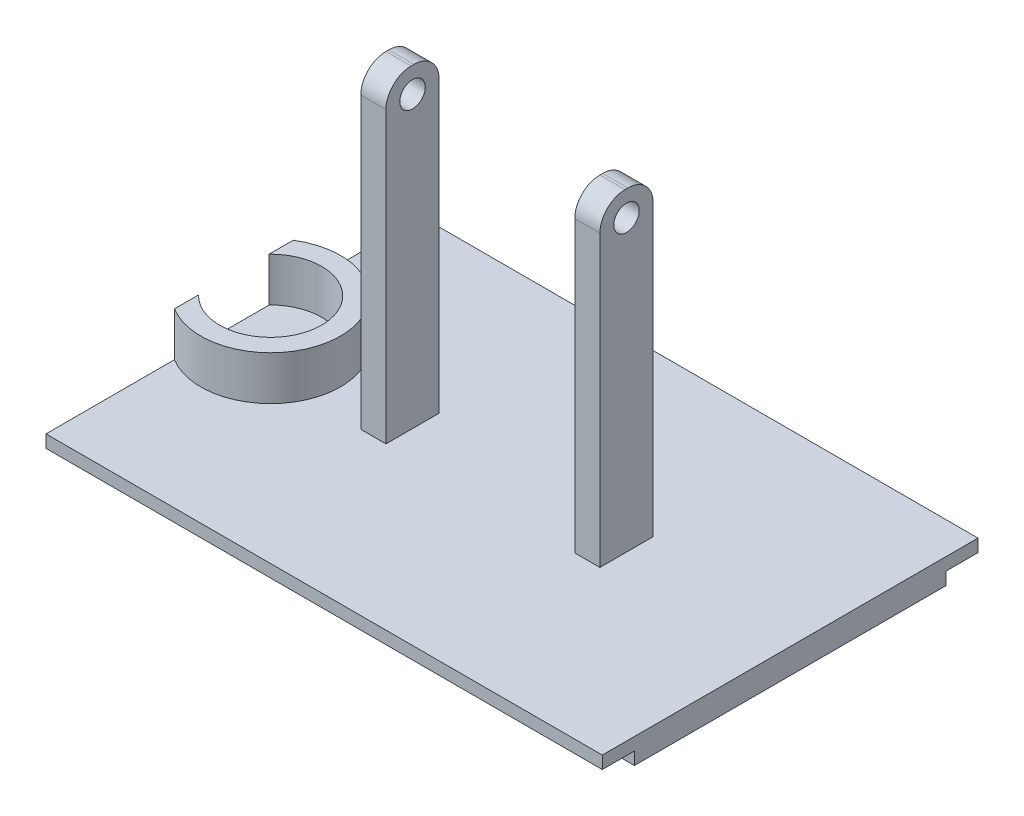
ISO-10303-21;
HEADER;
FILE_DESCRIPTION(('STEP AP214'),'2;1');
FILE_NAME('part.step','',(''),(''),'','','');
FILE_SCHEMA(('AUTOMOTIVE_DESIGN { 1 0 10303 214 1 1 1 1 }'));
ENDSEC;
DATA;
#1=APPLICATION_CONTEXT('core data for automotive mechanical design processes');
#2=APPLICATION_PROTOCOL_DEFINITION('international standard','automotive_design',2000,#1);
#3=PRODUCT_CONTEXT('',#1,'mechanical');
#4=PRODUCT('Part','Part','',(#3));
#5=PRODUCT_RELATED_PRODUCT_CATEGORY('part','',(#4));
#6=PRODUCT_DEFINITION_FORMATION('','',#4);
#7=PRODUCT_DEFINITION_CONTEXT('part definition',#1,'design');
#8=PRODUCT_DEFINITION('design','',#6,#7);
#9=PRODUCT_DEFINITION_SHAPE('','',#8);
#10=(LENGTH_UNIT() NAMED_UNIT(*) SI_UNIT(.MILLI.,.METRE.));
#11=(NAMED_UNIT(*) PLANE_ANGLE_UNIT() SI_UNIT($,.RADIAN.));
#12=(NAMED_UNIT(*) SI_UNIT($,.STERADIAN.) SOLID_ANGLE_UNIT());
#13=UNCERTAINTY_MEASURE_WITH_UNIT(LENGTH_MEASURE(1.E-05),#10,'distance_accuracy_value','');
#14=(GEOMETRIC_REPRESENTATION_CONTEXT(3) GLOBAL_UNCERTAINTY_ASSIGNED_CONTEXT((#13)) GLOBAL_UNIT_ASSIGNED_CONTEXT((#10,
#11,#12)) REPRESENTATION_CONTEXT('',''));
#15=CARTESIAN_POINT('',(0.,0.,0.));
#16=DIRECTION('',(0.,0.,1.));
#17=DIRECTION('',(1.,0.,0.));
#18=AXIS2_PLACEMENT_3D('',#15,#16,#17);
#19=CARTESIAN_POINT('',(-38.4161229651901,4.,59.7));
#20=DIRECTION('',(1.,0.,0.));
#21=DIRECTION('',(0.,0.,-1.));
#22=AXIS2_PLACEMENT_3D('',#19,#20,#21);
#23=PLANE('',#22);
#24=DIRECTION('',(0.,-1.,0.));
#25=VECTOR('',#24,1.);
#26=CARTESIAN_POINT('',(-38.4161229651901,-41.8587852174272,54.6));
#27=LINE('',#26,#25);
#28=CARTESIAN_POINT('',(-38.4161229651901,2.,54.6));
#29=VERTEX_POINT('',#28);
#30=CARTESIAN_POINT('',(-38.4161229651901,0.,54.6));
#31=VERTEX_POINT('',#30);
#32=EDGE_CURVE('E200',#29,#31,#27,.T.);
#33=ORIENTED_EDGE('',*,*,#32,.F.);
#34=DIRECTION('',(0.,0.,-1.));
#35=VECTOR('',#34,1.);
#36=CARTESIAN_POINT('',(-38.4161229651901,1.99999999999999,29.85));
#37=LINE('',#36,#35);
#38=CARTESIAN_POINT('',(-38.4161229651901,2.,59.7));
#39=VERTEX_POINT('',#38);
#40=EDGE_CURVE('E206',#39,#29,#37,.T.);
#41=ORIENTED_EDGE('',*,*,#40,.F.);
#42=DIRECTION('',(0.,-1.,0.));
#43=VECTOR('',#42,1.);
#44=CARTESIAN_POINT('',(-38.4161229651901,4.,59.7));
#45=LINE('',#44,#43);
#46=CARTESIAN_POINT('',(-38.4161229651901,4.,59.7));
#47=VERTEX_POINT('',#46);
#48=EDGE_CURVE('E352',#47,#39,#45,.T.);
#49=ORIENTED_EDGE('',*,*,#48,.F.);
#50=DIRECTION('',(0.,0.,1.));
#51=VECTOR('',#50,1.);
#52=CARTESIAN_POINT('',(-38.4161229651901,4.,59.7));
#53=LINE('',#52,#51);
#54=CARTESIAN_POINT('',(-38.4161229651901,4.,39.2883996562125));
#55=VERTEX_POINT('',#54);
#56=EDGE_CURVE('E326',#55,#47,#53,.T.);
#57=ORIENTED_EDGE('',*,*,#56,.F.);
#58=DIRECTION('',(0.,-1.,0.));
#59=VECTOR('',#58,1.);
#60=CARTESIAN_POINT('',(-38.4161229651901,11.,39.2883996562125));
#61=LINE('',#60,#59);
#62=CARTESIAN_POINT('',(-38.4161229651901,11.,39.2883996562125));
#63=VERTEX_POINT('',#62);
#64=EDGE_CURVE('E331',#63,#55,#61,.T.);
#65=ORIENTED_EDGE('',*,*,#64,.F.);
#66=DIRECTION('',(0.,0.,1.));
#67=VECTOR('',#66,1.);
#68=CARTESIAN_POINT('',(-38.4161229651901,11.,29.85));
#69=LINE('',#68,#67);
#70=CARTESIAN_POINT('',(-38.4161229651901,11.,35.4610059766848));
#71=VERTEX_POINT('',#70);
#72=EDGE_CURVE('E307',#71,#63,#69,.T.);
#73=ORIENTED_EDGE('',*,*,#72,.F.);
#74=DIRECTION('',(0.,-1.,0.));
#75=VECTOR('',#74,1.);
#76=CARTESIAN_POINT('',(-38.4161229651901,11.,35.4610059766848));
#77=LINE('',#76,#75);
#78=CARTESIAN_POINT('',(-38.4161229651901,4.,35.4610059766848));
#79=VERTEX_POINT('',#78);
#80=EDGE_CURVE('E317',#71,#79,#77,.T.);
#81=ORIENTED_EDGE('',*,*,#80,.T.);
#82=CARTESIAN_POINT('',(-38.4161229651901,4.,24.2389940233153));
#83=VERTEX_POINT('',#82);
#84=EDGE_CURVE('E533',#83,#79,#53,.T.);
#85=ORIENTED_EDGE('',*,*,#84,.F.);
#86=DIRECTION('',(0.,-1.,0.));
#87=VECTOR('',#86,1.);
#88=CARTESIAN_POINT('',(-38.4161229651901,11.,24.2389940233153));
#89=LINE('',#88,#87);
#90=CARTESIAN_POINT('',(-38.4161229651901,11.,24.2389940233153));
#91=VERTEX_POINT('',#90);
#92=EDGE_CURVE('E332',#91,#83,#89,.T.);
#93=ORIENTED_EDGE('',*,*,#92,.F.);
#94=CARTESIAN_POINT('',(-38.4161229651901,11.,20.4116003437875));
#95=VERTEX_POINT('',#94);
#96=EDGE_CURVE('E312',#95,#91,#69,.T.);
#97=ORIENTED_EDGE('',*,*,#96,.F.);
#98=DIRECTION('',(0.,-1.,0.));
#99=VECTOR('',#98,1.);
#100=CARTESIAN_POINT('',(-38.4161229651901,11.,20.4116003437875));
#101=LINE('',#100,#99);
#102=CARTESIAN_POINT('',(-38.4161229651901,4.,20.4116003437875));
#103=VERTEX_POINT('',#102);
#104=EDGE_CURVE('E328',#95,#103,#101,.T.);
#105=ORIENTED_EDGE('',*,*,#104,.T.);
#106=CARTESIAN_POINT('',(-38.4161229651901,4.,0.));
#107=VERTEX_POINT('',#106);
#108=EDGE_CURVE('E519',#107,#103,#53,.T.);
#109=ORIENTED_EDGE('',*,*,#108,.F.);
#110=DIRECTION('',(0.,-1.,0.));
#111=VECTOR('',#110,1.);
#112=CARTESIAN_POINT('',(-38.4161229651901,4.,0.));
#113=LINE('',#112,#111);
#114=CARTESIAN_POINT('',(-38.4161229651901,2.,0.));
#115=VERTEX_POINT('',#114);
#116=EDGE_CURVE('E514',#107,#115,#113,.T.);
#117=ORIENTED_EDGE('',*,*,#116,.T.);
#118=DIRECTION('',(0.,0.,1.));
#119=VECTOR('',#118,1.);
#120=CARTESIAN_POINT('',(-38.4161229651901,2.,29.85));
#121=LINE('',#120,#119);
#122=CARTESIAN_POINT('',(-38.4161229651901,2.,5.1));
#123=VERTEX_POINT('',#122);
#124=EDGE_CURVE('E229',#115,#123,#121,.T.);
#125=ORIENTED_EDGE('',*,*,#124,.T.);
#126=DIRECTION('',(0.,-1.,0.));
#127=VECTOR('',#126,1.);
#128=CARTESIAN_POINT('',(-38.4161229651901,-41.8587852174272,5.1));
#129=LINE('',#128,#127);
#130=CARTESIAN_POINT('',(-38.4161229651901,0.,5.1));
#131=VERTEX_POINT('',#130);
#132=EDGE_CURVE('E223',#123,#131,#129,.T.);
#133=ORIENTED_EDGE('',*,*,#132,.T.);
#134=DIRECTION('',(0.,0.,1.));
#135=VECTOR('',#134,1.);
#136=CARTESIAN_POINT('',(-38.4161229651901,0.,59.7));
#137=LINE('',#136,#135);
#138=EDGE_CURVE('E216',#131,#31,#137,.T.);
#139=ORIENTED_EDGE('',*,*,#138,.T.);
#140=EDGE_LOOP('',(#33,#41,#49,#57,#65,#73,#81,#85,#93,#97,#105,#109,#117,#125,#133,#139));
#141=FACE_BOUND('',#140,.T.);
#142=ADVANCED_FACE('F34',(#141),#23,.F.);
#143=CARTESIAN_POINT('',(49.9738770348099,4.,0.));
#144=DIRECTION('',(-1.,0.,0.));
#145=DIRECTION('',(0.,0.,1.));
#146=AXIS2_PLACEMENT_3D('',#143,#144,#145);
#147=PLANE('',#146);
#148=DIRECTION('',(0.,-1.,0.));
#149=VECTOR('',#148,1.);
#150=CARTESIAN_POINT('',(49.9738770348099,4.,59.7));
#151=LINE('',#150,#149);
#152=CARTESIAN_POINT('',(49.9738770348099,4.,59.7));
#153=VERTEX_POINT('',#152);
#154=CARTESIAN_POINT('',(49.9738770348099,2.,59.7));
#155=VERTEX_POINT('',#154);
#156=EDGE_CURVE('E522',#153,#155,#151,.T.);
#157=ORIENTED_EDGE('',*,*,#156,.T.);
#158=DIRECTION('',(0.,0.,1.));
#159=VECTOR('',#158,1.);
#160=CARTESIAN_POINT('',(49.9738770348099,1.99999999999999,29.85));
#161=LINE('',#160,#159);
#162=CARTESIAN_POINT('',(49.9738770348099,1.99999999999999,54.6));
#163=VERTEX_POINT('',#162);
#164=EDGE_CURVE('E49',#163,#155,#161,.T.);
#165=ORIENTED_EDGE('',*,*,#164,.F.);
#166=DIRECTION('',(0.,1.,0.));
#167=VECTOR('',#166,1.);
#168=CARTESIAN_POINT('',(49.9738770348099,-41.8587852174272,54.6));
#169=LINE('',#168,#167);
#170=CARTESIAN_POINT('',(49.9738770348099,0.,54.6));
#171=VERTEX_POINT('',#170);
#172=EDGE_CURVE('E202',#171,#163,#169,.T.);
#173=ORIENTED_EDGE('',*,*,#172,.F.);
#174=DIRECTION('',(0.,0.,-1.));
#175=VECTOR('',#174,1.);
#176=CARTESIAN_POINT('',(49.9738770348099,0.,0.));
#177=LINE('',#176,#175);
#178=CARTESIAN_POINT('',(49.9738770348099,0.,5.1));
#179=VERTEX_POINT('',#178);
#180=EDGE_CURVE('E57',#171,#179,#177,.T.);
#181=ORIENTED_EDGE('',*,*,#180,.T.);
#182=DIRECTION('',(0.,1.,0.));
#183=VECTOR('',#182,1.);
#184=CARTESIAN_POINT('',(49.9738770348099,-41.8587852174272,5.1));
#185=LINE('',#184,#183);
#186=CARTESIAN_POINT('',(49.9738770348099,2.,5.09999999999999));
#187=VERTEX_POINT('',#186);
#188=EDGE_CURVE('E224',#179,#187,#185,.T.);
#189=ORIENTED_EDGE('',*,*,#188,.T.);
#190=DIRECTION('',(0.,0.,-1.));
#191=VECTOR('',#190,1.);
#192=CARTESIAN_POINT('',(49.9738770348099,2.,29.85));
#193=LINE('',#192,#191);
#194=CARTESIAN_POINT('',(49.9738770348099,2.,0.));
#195=VERTEX_POINT('',#194);
#196=EDGE_CURVE('E227',#187,#195,#193,.T.);
#197=ORIENTED_EDGE('',*,*,#196,.T.);
#198=DIRECTION('',(0.,-1.,0.));
#199=VECTOR('',#198,1.);
#200=CARTESIAN_POINT('',(49.9738770348099,4.,0.));
#201=LINE('',#200,#199);
#202=CARTESIAN_POINT('',(49.9738770348099,4.,0.));
#203=VERTEX_POINT('',#202);
#204=EDGE_CURVE('E517',#203,#195,#201,.T.);
#205=ORIENTED_EDGE('',*,*,#204,.F.);
#206=DIRECTION('',(0.,0.,-1.));
#207=VECTOR('',#206,1.);
#208=CARTESIAN_POINT('',(49.9738770348099,4.,0.));
#209=LINE('',#208,#207);
#210=EDGE_CURVE('E524',#153,#203,#209,.T.);
#211=ORIENTED_EDGE('',*,*,#210,.F.);
#212=EDGE_LOOP('',(#157,#165,#173,#181,#189,#197,#205,#211));
#213=FACE_BOUND('',#212,.T.);
#214=ADVANCED_FACE('F421',(#213),#147,.F.);
#215=CARTESIAN_POINT('',(-38.4161229651901,4.,0.));
#216=DIRECTION('',(0.,0.,1.));
#217=DIRECTION('',(1.,0.,0.));
#218=AXIS2_PLACEMENT_3D('',#215,#216,#217);
#219=PLANE('',#218);
#220=DIRECTION('',(-1.,0.,0.));
#221=VECTOR('',#220,1.);
#222=CARTESIAN_POINT('',(55.4520154047309,2.,0.));
#223=LINE('',#222,#221);
#224=EDGE_CURVE('E235',#195,#115,#223,.T.);
#225=ORIENTED_EDGE('',*,*,#224,.T.);
#226=ORIENTED_EDGE('',*,*,#116,.F.);
#227=DIRECTION('',(-1.,0.,0.));
#228=VECTOR('',#227,1.);
#229=CARTESIAN_POINT('',(-38.4161229651901,4.,0.));
#230=LINE('',#229,#228);
#231=EDGE_CURVE('E520',#203,#107,#230,.T.);
#232=ORIENTED_EDGE('',*,*,#231,.F.);
#233=ORIENTED_EDGE('',*,*,#204,.T.);
#234=EDGE_LOOP('',(#225,#226,#232,#233));
#235=FACE_BOUND('',#234,.T.);
#236=ADVANCED_FACE('F426',(#235),#219,.F.);
#237=CARTESIAN_POINT('',(-38.4161229651901,0.,0.));
#238=DIRECTION('',(0.,-1.,0.));
#239=DIRECTION('',(0.,0.,-1.));
#240=AXIS2_PLACEMENT_3D('',#237,#238,#239);
#241=PLANE('',#240);
#242=DIRECTION('',(-1.,0.,0.));
#243=VECTOR('',#242,1.);
#244=CARTESIAN_POINT('',(55.4520154047309,0.,54.6));
#245=LINE('',#244,#243);
#246=EDGE_CURVE('E203',#171,#31,#245,.T.);
#247=ORIENTED_EDGE('',*,*,#246,.T.);
#248=ORIENTED_EDGE('',*,*,#138,.F.);
#249=DIRECTION('',(-1.,0.,0.));
#250=VECTOR('',#249,1.);
#251=CARTESIAN_POINT('',(55.4520154047309,0.,5.1));
#252=LINE('',#251,#250);
#253=EDGE_CURVE('E233',#179,#131,#252,.T.);
#254=ORIENTED_EDGE('',*,*,#253,.F.);
#255=ORIENTED_EDGE('',*,*,#180,.F.);
#256=EDGE_LOOP('',(#247,#248,#254,#255));
#257=FACE_BOUND('',#256,.T.);
#258=ADVANCED_FACE('F502',(#257),#241,.T.);
#259=CARTESIAN_POINT('',(-14.0261229651901,4.,25.626729832475));
#260=DIRECTION('',(1.,0.,0.));
#261=DIRECTION('',(0.,0.,1.));
#262=AXIS2_PLACEMENT_3D('',#259,#260,#261);
#263=PLANE('',#262);
#264=DIRECTION('',(0.,-1.,0.));
#265=VECTOR('',#264,1.);
#266=CARTESIAN_POINT('',(-14.0261229651901,4.,34.073270167525));
#267=LINE('',#266,#265);
#268=CARTESIAN_POINT('',(-14.0261229651901,50.,34.073270167525));
#269=VERTEX_POINT('',#268);
#270=CARTESIAN_POINT('',(-14.0261229651901,4.,34.073270167525));
#271=VERTEX_POINT('',#270);
#272=EDGE_CURVE('E250',#269,#271,#267,.T.);
#273=ORIENTED_EDGE('',*,*,#272,.F.);
#274=CARTESIAN_POINT('',(-14.0261229651901,50.,30.073270167525));
#275=DIRECTION('',(1.,0.,0.));
#276=DIRECTION('',(0.,0.,-1.));
#277=AXIS2_PLACEMENT_3D('',#274,#275,#276);
#278=CIRCLE('',#277,4.);
#279=CARTESIAN_POINT('',(-14.0261229651901,54.,30.073270167525));
#280=VERTEX_POINT('',#279);
#281=EDGE_CURVE('E42',#269,#280,#278,.F.);
#282=ORIENTED_EDGE('',*,*,#281,.T.);
#283=DIRECTION('',(0.,0.,1.));
#284=VECTOR('',#283,1.);
#285=CARTESIAN_POINT('',(-14.0261229651901,54.,34.073270167525));
#286=LINE('',#285,#284);
#287=CARTESIAN_POINT('',(-14.0261229651901,54.,29.626729832475));
#288=VERTEX_POINT('',#287);
#289=EDGE_CURVE('E253',#288,#280,#286,.T.);
#290=ORIENTED_EDGE('',*,*,#289,.F.);
#291=CARTESIAN_POINT('',(-14.0261229651901,50.,29.626729832475));
#292=DIRECTION('',(1.,0.,0.));
#293=DIRECTION('',(0.,0.,-1.));
#294=AXIS2_PLACEMENT_3D('',#291,#292,#293);
#295=CIRCLE('',#294,4.);
#296=CARTESIAN_POINT('',(-14.0261229651901,50.,25.626729832475));
#297=VERTEX_POINT('',#296);
#298=EDGE_CURVE('E378',#288,#297,#295,.F.);
#299=ORIENTED_EDGE('',*,*,#298,.T.);
#300=DIRECTION('',(0.,1.,0.));
#301=VECTOR('',#300,1.);
#302=CARTESIAN_POINT('',(-14.0261229651901,54.,25.626729832475));
#303=LINE('',#302,#301);
#304=CARTESIAN_POINT('',(-14.0261229651901,4.,25.626729832475));
#305=VERTEX_POINT('',#304);
#306=EDGE_CURVE('E256',#305,#297,#303,.T.);
#307=ORIENTED_EDGE('',*,*,#306,.F.);
#308=DIRECTION('',(0.,0.,-1.));
#309=VECTOR('',#308,1.);
#310=CARTESIAN_POINT('',(-14.0261229651901,4.,27.6967834458924));
#311=LINE('',#310,#309);
#312=EDGE_CURVE('E247',#271,#305,#311,.T.);
#313=ORIENTED_EDGE('',*,*,#312,.F.);
#314=EDGE_LOOP('',(#273,#282,#290,#299,#307,#313));
#315=FACE_BOUND('',#314,.T.);
#316=CARTESIAN_POINT('',(-14.0261229651901,50.,29.85));
#317=DIRECTION('',(1.,0.,0.));
#318=DIRECTION('',(0.,0.,-1.));
#319=AXIS2_PLACEMENT_3D('',#316,#317,#318);
#320=CIRCLE('',#319,2.025);
#321=CARTESIAN_POINT('',(-14.0261229651901,50.,27.825));
#322=VERTEX_POINT('',#321);
#323=EDGE_CURVE('E226',#322,#322,#320,.T.);
#324=ORIENTED_EDGE('',*,*,#323,.T.);
#325=EDGE_LOOP('',(#324));
#326=FACE_BOUND('',#325,.T.);
#327=ADVANCED_FACE('F383',(#315,#326),#263,.F.);
#328=CARTESIAN_POINT('',(-10.0261229651901,4.,25.626729832475));
#329=DIRECTION('',(1.,0.,0.));
#330=DIRECTION('',(0.,0.,1.));
#331=AXIS2_PLACEMENT_3D('',#328,#329,#330);
#332=PLANE('',#331);
#333=DIRECTION('',(0.,0.,1.));
#334=VECTOR('',#333,1.);
#335=CARTESIAN_POINT('',(-10.0261229651901,54.,34.073270167525));
#336=LINE('',#335,#334);
#337=CARTESIAN_POINT('',(-10.0261229651901,54.,29.626729832475));
#338=VERTEX_POINT('',#337);
#339=CARTESIAN_POINT('',(-10.0261229651901,54.,30.073270167525));
#340=VERTEX_POINT('',#339);
#341=EDGE_CURVE('E263',#338,#340,#336,.T.);
#342=ORIENTED_EDGE('',*,*,#341,.T.);
#343=CARTESIAN_POINT('',(-10.0261229651901,50.,30.073270167525));
#344=DIRECTION('',(1.,0.,0.));
#345=DIRECTION('',(0.,0.,-1.));
#346=AXIS2_PLACEMENT_3D('',#343,#344,#345);
#347=CIRCLE('',#346,4.);
#348=CARTESIAN_POINT('',(-10.0261229651901,50.,34.073270167525));
#349=VERTEX_POINT('',#348);
#350=EDGE_CURVE('E374',#340,#349,#347,.T.);
#351=ORIENTED_EDGE('',*,*,#350,.T.);
#352=DIRECTION('',(0.,-1.,0.));
#353=VECTOR('',#352,1.);
#354=CARTESIAN_POINT('',(-10.0261229651901,4.,34.073270167525));
#355=LINE('',#354,#353);
#356=CARTESIAN_POINT('',(-10.0261229651901,4.,34.073270167525));
#357=VERTEX_POINT('',#356);
#358=EDGE_CURVE('E261',#349,#357,#355,.T.);
#359=ORIENTED_EDGE('',*,*,#358,.T.);
#360=DIRECTION('',(0.,0.,-1.));
#361=VECTOR('',#360,1.);
#362=CARTESIAN_POINT('',(-10.0261229651901,4.,32.0032165541076));
#363=LINE('',#362,#361);
#364=CARTESIAN_POINT('',(-10.0261229651901,4.,25.626729832475));
#365=VERTEX_POINT('',#364);
#366=EDGE_CURVE('E244',#357,#365,#363,.T.);
#367=ORIENTED_EDGE('',*,*,#366,.T.);
#368=DIRECTION('',(0.,1.,0.));
#369=VECTOR('',#368,1.);
#370=CARTESIAN_POINT('',(-10.0261229651901,54.,25.626729832475));
#371=LINE('',#370,#369);
#372=CARTESIAN_POINT('',(-10.0261229651901,50.,25.626729832475));
#373=VERTEX_POINT('',#372);
#374=EDGE_CURVE('E251',#365,#373,#371,.T.);
#375=ORIENTED_EDGE('',*,*,#374,.T.);
#376=CARTESIAN_POINT('',(-10.0261229651901,50.,29.626729832475));
#377=DIRECTION('',(1.,0.,0.));
#378=DIRECTION('',(0.,0.,-1.));
#379=AXIS2_PLACEMENT_3D('',#376,#377,#378);
#380=CIRCLE('',#379,4.);
#381=EDGE_CURVE('E372',#373,#338,#380,.T.);
#382=ORIENTED_EDGE('',*,*,#381,.T.);
#383=EDGE_LOOP('',(#342,#351,#359,#367,#375,#382));
#384=FACE_BOUND('',#383,.T.);
#385=CARTESIAN_POINT('',(-10.0261229651901,50.,29.85));
#386=DIRECTION('',(1.,0.,0.));
#387=DIRECTION('',(0.,0.,-1.));
#388=AXIS2_PLACEMENT_3D('',#385,#386,#387);
#389=CIRCLE('',#388,2.025);
#390=CARTESIAN_POINT('',(-10.0261229651901,50.,27.825));
#391=VERTEX_POINT('',#390);
#392=EDGE_CURVE('E241',#391,#391,#389,.T.);
#393=ORIENTED_EDGE('',*,*,#392,.F.);
#394=EDGE_LOOP('',(#393));
#395=FACE_BOUND('',#394,.T.);
#396=ADVANCED_FACE('F397',(#384,#395),#332,.T.);
#397=CARTESIAN_POINT('',(-38.4161229651901,4.,0.));
#398=DIRECTION('',(0.,-1.,0.));
#399=DIRECTION('',(0.,0.,-1.));
#400=AXIS2_PLACEMENT_3D('',#397,#398,#399);
#401=PLANE('',#400);
#402=DIRECTION('',(0.,0.,-1.));
#403=VECTOR('',#402,1.);
#404=CARTESIAN_POINT('',(23.9738770348099,4.,27.6967834458924));
#405=LINE('',#404,#403);
#406=CARTESIAN_POINT('',(23.9738770348099,4.,34.073270167525));
#407=VERTEX_POINT('',#406);
#408=CARTESIAN_POINT('',(23.9738770348099,4.,25.6267298324749));
#409=VERTEX_POINT('',#408);
#410=EDGE_CURVE('E280',#407,#409,#405,.T.);
#411=ORIENTED_EDGE('',*,*,#410,.F.);
#412=DIRECTION('',(-1.,0.,0.));
#413=VECTOR('',#412,1.);
#414=CARTESIAN_POINT('',(23.9738770348099,4.,34.073270167525));
#415=LINE('',#414,#413);
#416=CARTESIAN_POINT('',(19.9738770348099,4.,34.073270167525));
#417=VERTEX_POINT('',#416);
#418=EDGE_CURVE('E292',#407,#417,#415,.T.);
#419=ORIENTED_EDGE('',*,*,#418,.T.);
#420=DIRECTION('',(0.,0.,-1.));
#421=VECTOR('',#420,1.);
#422=CARTESIAN_POINT('',(19.9738770348099,4.,32.0032165541076));
#423=LINE('',#422,#421);
#424=CARTESIAN_POINT('',(19.9738770348099,4.,25.6267298324749));
#425=VERTEX_POINT('',#424);
#426=EDGE_CURVE('E284',#417,#425,#423,.T.);
#427=ORIENTED_EDGE('',*,*,#426,.T.);
#428=DIRECTION('',(-1.,0.,0.));
#429=VECTOR('',#428,1.);
#430=CARTESIAN_POINT('',(23.9738770348099,4.,25.6267298324749));
#431=LINE('',#430,#429);
#432=EDGE_CURVE('E304',#409,#425,#431,.T.);
#433=ORIENTED_EDGE('',*,*,#432,.F.);
#434=EDGE_LOOP('',(#411,#419,#427,#433));
#435=FACE_BOUND('',#434,.T.);
#436=CARTESIAN_POINT('',(-32.5743242756076,4.,29.85));
#437=DIRECTION('',(0.,1.,0.));
#438=DIRECTION('',(0.,0.,1.));
#439=AXIS2_PLACEMENT_3D('',#436,#437,#438);
#440=CIRCLE('',#439,11.1);
#441=EDGE_CURVE('E306',#55,#103,#440,.T.);
#442=ORIENTED_EDGE('',*,*,#441,.F.);
#443=ORIENTED_EDGE('',*,*,#56,.T.);
#444=DIRECTION('',(1.,0.,0.));
#445=VECTOR('',#444,1.);
#446=CARTESIAN_POINT('',(49.9738770348099,4.,59.7));
#447=LINE('',#446,#445);
#448=EDGE_CURVE('E532',#47,#153,#447,.T.);
#449=ORIENTED_EDGE('',*,*,#448,.T.);
#450=ORIENTED_EDGE('',*,*,#210,.T.);
#451=ORIENTED_EDGE('',*,*,#231,.T.);
#452=ORIENTED_EDGE('',*,*,#108,.T.);
#453=EDGE_LOOP('',(#442,#443,#449,#450,#451,#452));
#454=FACE_BOUND('',#453,.T.);
#455=ORIENTED_EDGE('',*,*,#312,.T.);
#456=DIRECTION('',(1.,0.,0.));
#457=VECTOR('',#456,1.);
#458=CARTESIAN_POINT('',(-14.0261229651901,4.,25.626729832475));
#459=LINE('',#458,#457);
#460=EDGE_CURVE('E259',#305,#365,#459,.T.);
#461=ORIENTED_EDGE('',*,*,#460,.T.);
#462=ORIENTED_EDGE('',*,*,#366,.F.);
#463=DIRECTION('',(1.,0.,0.));
#464=VECTOR('',#463,1.);
#465=CARTESIAN_POINT('',(-14.0261229651901,4.,34.073270167525));
#466=LINE('',#465,#464);
#467=EDGE_CURVE('E270',#271,#357,#466,.T.);
#468=ORIENTED_EDGE('',*,*,#467,.F.);
#469=EDGE_LOOP('',(#455,#461,#462,#468));
#470=FACE_BOUND('',#469,.T.);
#471=ADVANCED_FACE('F404',(#435,#454,#470),#401,.F.);
#472=CARTESIAN_POINT('',(49.9738770348099,4.,59.7));
#473=DIRECTION('',(0.,0.,-1.));
#474=DIRECTION('',(-1.,0.,0.));
#475=AXIS2_PLACEMENT_3D('',#472,#473,#474);
#476=PLANE('',#475);
#477=ORIENTED_EDGE('',*,*,#48,.T.);
#478=DIRECTION('',(-1.,0.,0.));
#479=VECTOR('',#478,1.);
#480=CARTESIAN_POINT('',(55.4520154047309,2.,59.7));
#481=LINE('',#480,#479);
#482=EDGE_CURVE('E208',#155,#39,#481,.T.);
#483=ORIENTED_EDGE('',*,*,#482,.F.);
#484=ORIENTED_EDGE('',*,*,#156,.F.);
#485=ORIENTED_EDGE('',*,*,#448,.F.);
#486=EDGE_LOOP('',(#477,#483,#484,#485));
#487=FACE_BOUND('',#486,.T.);
#488=ADVANCED_FACE('F430',(#487),#476,.F.);
#489=ORIENTED_EDGE('',*,*,#84,.T.);
#490=CARTESIAN_POINT('',(-32.5743242756076,4.,29.85));
#491=DIRECTION('',(0.,1.,0.));
#492=DIRECTION('',(0.,0.,1.));
#493=AXIS2_PLACEMENT_3D('',#490,#491,#492);
#494=CIRCLE('',#493,8.1);
#495=EDGE_CURVE('E311',#79,#83,#494,.T.);
#496=ORIENTED_EDGE('',*,*,#495,.T.);
#497=EDGE_LOOP('',(#489,#496));
#498=FACE_BOUND('',#497,.T.);
#499=ADVANCED_FACE('F497',(#498),#401,.F.);
#500=CARTESIAN_POINT('',(-32.5743242756076,11.,29.85));
#501=DIRECTION('',(0.,-1.,0.));
#502=DIRECTION('',(0.,0.,-1.));
#503=AXIS2_PLACEMENT_3D('',#500,#501,#502);
#504=CYLINDRICAL_SURFACE('',#503,11.1);
#505=ORIENTED_EDGE('',*,*,#441,.T.);
#506=ORIENTED_EDGE('',*,*,#104,.F.);
#507=CARTESIAN_POINT('',(-32.5743242756076,11.,29.85));
#508=DIRECTION('',(0.,1.,0.));
#509=DIRECTION('',(0.,0.,1.));
#510=AXIS2_PLACEMENT_3D('',#507,#508,#509);
#511=CIRCLE('',#510,11.1);
#512=EDGE_CURVE('E310',#63,#95,#511,.T.);
#513=ORIENTED_EDGE('',*,*,#512,.F.);
#514=ORIENTED_EDGE('',*,*,#64,.T.);
#515=EDGE_LOOP('',(#505,#506,#513,#514));
#516=FACE_BOUND('',#515,.T.);
#517=ADVANCED_FACE('F493',(#516),#504,.T.);
#518=CARTESIAN_POINT('',(-32.5743242756076,11.,29.85));
#519=DIRECTION('',(0.,-1.,0.));
#520=DIRECTION('',(0.,0.,-1.));
#521=AXIS2_PLACEMENT_3D('',#518,#519,#520);
#522=CYLINDRICAL_SURFACE('',#521,8.1);
#523=ORIENTED_EDGE('',*,*,#495,.F.);
#524=ORIENTED_EDGE('',*,*,#80,.F.);
#525=CARTESIAN_POINT('',(-32.5743242756076,11.,29.85));
#526=DIRECTION('',(0.,1.,0.));
#527=DIRECTION('',(0.,0.,1.));
#528=AXIS2_PLACEMENT_3D('',#525,#526,#527);
#529=CIRCLE('',#528,8.1);
#530=EDGE_CURVE('E314',#71,#91,#529,.T.);
#531=ORIENTED_EDGE('',*,*,#530,.T.);
#532=ORIENTED_EDGE('',*,*,#92,.T.);
#533=EDGE_LOOP('',(#523,#524,#531,#532));
#534=FACE_BOUND('',#533,.T.);
#535=ADVANCED_FACE('F489',(#534),#522,.F.);
#536=CARTESIAN_POINT('',(-77.3264742578763,11.,29.85));
#537=DIRECTION('',(0.,1.,0.));
#538=DIRECTION('',(0.,0.,1.));
#539=AXIS2_PLACEMENT_3D('',#536,#537,#538);
#540=PLANE('',#539);
#541=ORIENTED_EDGE('',*,*,#72,.T.);
#542=ORIENTED_EDGE('',*,*,#512,.T.);
#543=ORIENTED_EDGE('',*,*,#96,.T.);
#544=ORIENTED_EDGE('',*,*,#530,.F.);
#545=EDGE_LOOP('',(#541,#542,#543,#544));
#546=FACE_BOUND('',#545,.T.);
#547=ADVANCED_FACE('F486',(#546),#540,.T.);
#548=CARTESIAN_POINT('',(23.9738770348099,54.,25.6267298324749));
#549=DIRECTION('',(0.,0.,1.));
#550=DIRECTION('',(1.,0.,0.));
#551=AXIS2_PLACEMENT_3D('',#548,#549,#550);
#552=PLANE('',#551);
#553=DIRECTION('',(0.,1.,0.));
#554=VECTOR('',#553,1.);
#555=CARTESIAN_POINT('',(19.9738770348099,54.,25.6267298324749));
#556=LINE('',#555,#554);
#557=CARTESIAN_POINT('',(19.9738770348099,50.,25.6267298324749));
#558=VERTEX_POINT('',#557);
#559=EDGE_CURVE('E277',#425,#558,#556,.T.);
#560=ORIENTED_EDGE('',*,*,#559,.T.);
#561=DIRECTION('',(-1.,0.,0.));
#562=VECTOR('',#561,1.);
#563=CARTESIAN_POINT('',(23.9738770348099,50.,25.6267298324749));
#564=LINE('',#563,#562);
#565=CARTESIAN_POINT('',(23.9738770348099,50.,25.6267298324749));
#566=VERTEX_POINT('',#565);
#567=EDGE_CURVE('E365',#558,#566,#564,.F.);
#568=ORIENTED_EDGE('',*,*,#567,.T.);
#569=DIRECTION('',(0.,1.,0.));
#570=VECTOR('',#569,1.);
#571=CARTESIAN_POINT('',(23.9738770348099,54.,25.6267298324749));
#572=LINE('',#571,#570);
#573=EDGE_CURVE('E283',#409,#566,#572,.T.);
#574=ORIENTED_EDGE('',*,*,#573,.F.);
#575=ORIENTED_EDGE('',*,*,#432,.T.);
#576=EDGE_LOOP('',(#560,#568,#574,#575));
#577=FACE_BOUND('',#576,.T.);
#578=ADVANCED_FACE('F469',(#577),#552,.F.);
#579=CARTESIAN_POINT('',(23.9738770348099,54.,34.073270167525));
#580=DIRECTION('',(0.,-1.,0.));
#581=DIRECTION('',(0.,0.,-1.));
#582=AXIS2_PLACEMENT_3D('',#579,#580,#581);
#583=PLANE('',#582);
#584=DIRECTION('',(0.,0.,1.));
#585=VECTOR('',#584,1.);
#586=CARTESIAN_POINT('',(19.9738770348099,54.,34.073270167525));
#587=LINE('',#586,#585);
#588=CARTESIAN_POINT('',(19.9738770348099,54.,29.6267298324749));
#589=VERTEX_POINT('',#588);
#590=CARTESIAN_POINT('',(19.9738770348099,54.,30.073270167525));
#591=VERTEX_POINT('',#590);
#592=EDGE_CURVE('E295',#589,#591,#587,.T.);
#593=ORIENTED_EDGE('',*,*,#592,.T.);
#594=DIRECTION('',(-1.,0.,0.));
#595=VECTOR('',#594,1.);
#596=CARTESIAN_POINT('',(23.9738770348099,54.,30.073270167525));
#597=LINE('',#596,#595);
#598=CARTESIAN_POINT('',(23.9738770348099,54.,30.073270167525));
#599=VERTEX_POINT('',#598);
#600=EDGE_CURVE('E359',#591,#599,#597,.F.);
#601=ORIENTED_EDGE('',*,*,#600,.T.);
#602=DIRECTION('',(0.,0.,1.));
#603=VECTOR('',#602,1.);
#604=CARTESIAN_POINT('',(23.9738770348099,54.,34.073270167525));
#605=LINE('',#604,#603);
#606=CARTESIAN_POINT('',(23.9738770348099,54.,29.6267298324749));
#607=VERTEX_POINT('',#606);
#608=EDGE_CURVE('E287',#607,#599,#605,.T.);
#609=ORIENTED_EDGE('',*,*,#608,.F.);
#610=DIRECTION('',(-1.,0.,0.));
#611=VECTOR('',#610,1.);
#612=CARTESIAN_POINT('',(23.9738770348099,54.,29.6267298324749));
#613=LINE('',#612,#611);
#614=EDGE_CURVE('E356',#607,#589,#613,.T.);
#615=ORIENTED_EDGE('',*,*,#614,.T.);
#616=EDGE_LOOP('',(#593,#601,#609,#615));
#617=FACE_BOUND('',#616,.T.);
#618=ADVANCED_FACE('F453',(#617),#583,.F.);
#619=CARTESIAN_POINT('',(23.9738770348099,4.,34.073270167525));
#620=DIRECTION('',(0.,0.,-1.));
#621=DIRECTION('',(-1.,0.,0.));
#622=AXIS2_PLACEMENT_3D('',#619,#620,#621);
#623=PLANE('',#622);
#624=DIRECTION('',(0.,-1.,0.));
#625=VECTOR('',#624,1.);
#626=CARTESIAN_POINT('',(23.9738770348099,4.,34.073270167525));
#627=LINE('',#626,#625);
#628=CARTESIAN_POINT('',(23.9738770348099,50.,34.073270167525));
#629=VERTEX_POINT('',#628);
#630=EDGE_CURVE('E290',#629,#407,#627,.T.);
#631=ORIENTED_EDGE('',*,*,#630,.F.);
#632=DIRECTION('',(-1.,0.,0.));
#633=VECTOR('',#632,1.);
#634=CARTESIAN_POINT('',(23.9738770348099,50.,34.073270167525));
#635=LINE('',#634,#633);
#636=CARTESIAN_POINT('',(19.9738770348099,50.,34.073270167525));
#637=VERTEX_POINT('',#636);
#638=EDGE_CURVE('E348',#629,#637,#635,.T.);
#639=ORIENTED_EDGE('',*,*,#638,.T.);
#640=DIRECTION('',(0.,-1.,0.));
#641=VECTOR('',#640,1.);
#642=CARTESIAN_POINT('',(19.9738770348099,4.,34.073270167525));
#643=LINE('',#642,#641);
#644=EDGE_CURVE('E298',#637,#417,#643,.T.);
#645=ORIENTED_EDGE('',*,*,#644,.T.);
#646=ORIENTED_EDGE('',*,*,#418,.F.);
#647=EDGE_LOOP('',(#631,#639,#645,#646));
#648=FACE_BOUND('',#647,.T.);
#649=ADVANCED_FACE('F460',(#648),#623,.F.);
#650=CARTESIAN_POINT('',(23.9738770348099,4.,25.6267298324749));
#651=DIRECTION('',(-1.,0.,0.));
#652=DIRECTION('',(0.,0.,1.));
#653=AXIS2_PLACEMENT_3D('',#650,#651,#652);
#654=PLANE('',#653);
#655=CARTESIAN_POINT('',(23.9738770348099,50.,29.85));
#656=DIRECTION('',(1.,0.,0.));
#657=DIRECTION('',(0.,0.,-1.));
#658=AXIS2_PLACEMENT_3D('',#655,#656,#657);
#659=CIRCLE('',#658,2.025);
#660=CARTESIAN_POINT('',(23.9738770348099,50.,27.825));
#661=VERTEX_POINT('',#660);
#662=EDGE_CURVE('E273',#661,#661,#659,.T.);
#663=ORIENTED_EDGE('',*,*,#662,.F.);
#664=EDGE_LOOP('',(#663));
#665=FACE_BOUND('',#664,.T.);
#666=ORIENTED_EDGE('',*,*,#608,.T.);
#667=CARTESIAN_POINT('',(23.9738770348099,50.,30.073270167525));
#668=DIRECTION('',(-1.,0.,0.));
#669=DIRECTION('',(0.,0.,1.));
#670=AXIS2_PLACEMENT_3D('',#667,#668,#669);
#671=CIRCLE('',#670,4.);
#672=EDGE_CURVE('E363',#599,#629,#671,.F.);
#673=ORIENTED_EDGE('',*,*,#672,.T.);
#674=ORIENTED_EDGE('',*,*,#630,.T.);
#675=ORIENTED_EDGE('',*,*,#410,.T.);
#676=ORIENTED_EDGE('',*,*,#573,.T.);
#677=CARTESIAN_POINT('',(23.9738770348099,50.,29.6267298324749));
#678=DIRECTION('',(-1.,0.,0.));
#679=DIRECTION('',(0.,0.,1.));
#680=AXIS2_PLACEMENT_3D('',#677,#678,#679);
#681=CIRCLE('',#680,4.);
#682=EDGE_CURVE('E361',#566,#607,#681,.F.);
#683=ORIENTED_EDGE('',*,*,#682,.T.);
#684=EDGE_LOOP('',(#666,#673,#674,#675,#676,#683));
#685=FACE_BOUND('',#684,.T.);
#686=ADVANCED_FACE('F450',(#665,#685),#654,.F.);
#687=CARTESIAN_POINT('',(19.9738770348099,4.,25.6267298324749));
#688=DIRECTION('',(-1.,0.,0.));
#689=DIRECTION('',(0.,0.,1.));
#690=AXIS2_PLACEMENT_3D('',#687,#688,#689);
#691=PLANE('',#690);
#692=CARTESIAN_POINT('',(19.9738770348099,50.,29.85));
#693=DIRECTION('',(1.,0.,0.));
#694=DIRECTION('',(0.,0.,-1.));
#695=AXIS2_PLACEMENT_3D('',#692,#693,#694);
#696=CIRCLE('',#695,2.025);
#697=CARTESIAN_POINT('',(19.9738770348099,50.,27.825));
#698=VERTEX_POINT('',#697);
#699=EDGE_CURVE('E274',#698,#698,#696,.T.);
#700=ORIENTED_EDGE('',*,*,#699,.T.);
#701=EDGE_LOOP('',(#700));
#702=FACE_BOUND('',#701,.T.);
#703=ORIENTED_EDGE('',*,*,#644,.F.);
#704=CARTESIAN_POINT('',(19.9738770348099,50.,30.073270167525));
#705=DIRECTION('',(-1.,0.,0.));
#706=DIRECTION('',(0.,0.,1.));
#707=AXIS2_PLACEMENT_3D('',#704,#705,#706);
#708=CIRCLE('',#707,4.);
#709=EDGE_CURVE('E354',#637,#591,#708,.T.);
#710=ORIENTED_EDGE('',*,*,#709,.T.);
#711=ORIENTED_EDGE('',*,*,#592,.F.);
#712=CARTESIAN_POINT('',(19.9738770348099,50.,29.6267298324749));
#713=DIRECTION('',(-1.,0.,0.));
#714=DIRECTION('',(0.,0.,1.));
#715=AXIS2_PLACEMENT_3D('',#712,#713,#714);
#716=CIRCLE('',#715,4.);
#717=EDGE_CURVE('E351',#589,#558,#716,.T.);
#718=ORIENTED_EDGE('',*,*,#717,.T.);
#719=ORIENTED_EDGE('',*,*,#559,.F.);
#720=ORIENTED_EDGE('',*,*,#426,.F.);
#721=EDGE_LOOP('',(#703,#710,#711,#718,#719,#720));
#722=FACE_BOUND('',#721,.T.);
#723=ADVANCED_FACE('F435',(#702,#722),#691,.T.);
#724=CARTESIAN_POINT('',(23.9738770348099,50.,30.073270167525));
#725=DIRECTION('',(-1.,0.,0.));
#726=DIRECTION('',(0.,0.,1.));
#727=AXIS2_PLACEMENT_3D('',#724,#725,#726);
#728=CYLINDRICAL_SURFACE('',#727,4.);
#729=ORIENTED_EDGE('',*,*,#672,.F.);
#730=ORIENTED_EDGE('',*,*,#600,.F.);
#731=ORIENTED_EDGE('',*,*,#709,.F.);
#732=ORIENTED_EDGE('',*,*,#638,.F.);
#733=EDGE_LOOP('',(#729,#730,#731,#732));
#734=FACE_BOUND('',#733,.T.);
#735=ADVANCED_FACE('F431',(#734),#728,.T.);
#736=CARTESIAN_POINT('',(23.9738770348099,50.,29.6267298324749));
#737=DIRECTION('',(-1.,0.,0.));
#738=DIRECTION('',(0.,0.,1.));
#739=AXIS2_PLACEMENT_3D('',#736,#737,#738);
#740=CYLINDRICAL_SURFACE('',#739,4.);
#741=ORIENTED_EDGE('',*,*,#682,.F.);
#742=ORIENTED_EDGE('',*,*,#567,.F.);
#743=ORIENTED_EDGE('',*,*,#717,.F.);
#744=ORIENTED_EDGE('',*,*,#614,.F.);
#745=EDGE_LOOP('',(#741,#742,#743,#744));
#746=FACE_BOUND('',#745,.T.);
#747=ADVANCED_FACE('F434',(#746),#740,.T.);
#748=CARTESIAN_POINT('',(19.9738770348099,50.,29.85));
#749=DIRECTION('',(1.,0.,0.));
#750=DIRECTION('',(0.,0.,-1.));
#751=AXIS2_PLACEMENT_3D('',#748,#749,#750);
#752=CYLINDRICAL_SURFACE('',#751,2.025);
#753=ORIENTED_EDGE('',*,*,#699,.F.);
#754=EDGE_LOOP('',(#753));
#755=FACE_BOUND('',#754,.T.);
#756=ORIENTED_EDGE('',*,*,#662,.T.);
#757=EDGE_LOOP('',(#756));
#758=FACE_BOUND('',#757,.T.);
#759=ADVANCED_FACE('F438',(#755,#758),#752,.F.);
#760=CARTESIAN_POINT('',(-14.0261229651901,4.,34.073270167525));
#761=DIRECTION('',(0.,0.,1.));
#762=DIRECTION('',(1.,0.,0.));
#763=AXIS2_PLACEMENT_3D('',#760,#761,#762);
#764=PLANE('',#763);
#765=ORIENTED_EDGE('',*,*,#358,.F.);
#766=DIRECTION('',(1.,0.,0.));
#767=VECTOR('',#766,1.);
#768=CARTESIAN_POINT('',(-14.0261229651901,50.,34.073270167525));
#769=LINE('',#768,#767);
#770=EDGE_CURVE('E376',#349,#269,#769,.F.);
#771=ORIENTED_EDGE('',*,*,#770,.T.);
#772=ORIENTED_EDGE('',*,*,#272,.T.);
#773=ORIENTED_EDGE('',*,*,#467,.T.);
#774=EDGE_LOOP('',(#765,#771,#772,#773));
#775=FACE_BOUND('',#774,.T.);
#776=ADVANCED_FACE('F400',(#775),#764,.T.);
#777=CARTESIAN_POINT('',(-14.0261229651901,54.,34.073270167525));
#778=DIRECTION('',(0.,1.,0.));
#779=DIRECTION('',(0.,0.,1.));
#780=AXIS2_PLACEMENT_3D('',#777,#778,#779);
#781=PLANE('',#780);
#782=ORIENTED_EDGE('',*,*,#289,.T.);
#783=DIRECTION('',(1.,0.,0.));
#784=VECTOR('',#783,1.);
#785=CARTESIAN_POINT('',(-14.0261229651901,54.,30.073270167525));
#786=LINE('',#785,#784);
#787=EDGE_CURVE('E369',#280,#340,#786,.T.);
#788=ORIENTED_EDGE('',*,*,#787,.T.);
#789=ORIENTED_EDGE('',*,*,#341,.F.);
#790=DIRECTION('',(1.,0.,0.));
#791=VECTOR('',#790,1.);
#792=CARTESIAN_POINT('',(-14.0261229651901,54.,29.626729832475));
#793=LINE('',#792,#791);
#794=EDGE_CURVE('E367',#338,#288,#793,.F.);
#795=ORIENTED_EDGE('',*,*,#794,.T.);
#796=EDGE_LOOP('',(#782,#788,#789,#795));
#797=FACE_BOUND('',#796,.T.);
#798=ADVANCED_FACE('F391',(#797),#781,.T.);
#799=CARTESIAN_POINT('',(-14.0261229651901,54.,25.626729832475));
#800=DIRECTION('',(0.,0.,-1.));
#801=DIRECTION('',(-1.,0.,0.));
#802=AXIS2_PLACEMENT_3D('',#799,#800,#801);
#803=PLANE('',#802);
#804=ORIENTED_EDGE('',*,*,#306,.T.);
#805=DIRECTION('',(1.,0.,0.));
#806=VECTOR('',#805,1.);
#807=CARTESIAN_POINT('',(-14.0261229651901,50.,25.626729832475));
#808=LINE('',#807,#806);
#809=EDGE_CURVE('E11',#297,#373,#808,.T.);
#810=ORIENTED_EDGE('',*,*,#809,.T.);
#811=ORIENTED_EDGE('',*,*,#374,.F.);
#812=ORIENTED_EDGE('',*,*,#460,.F.);
#813=EDGE_LOOP('',(#804,#810,#811,#812));
#814=FACE_BOUND('',#813,.T.);
#815=ADVANCED_FACE('F407',(#814),#803,.T.);
#816=CARTESIAN_POINT('',(-14.0261229651901,50.,30.073270167525));
#817=DIRECTION('',(1.,0.,0.));
#818=DIRECTION('',(0.,0.,-1.));
#819=AXIS2_PLACEMENT_3D('',#816,#817,#818);
#820=CYLINDRICAL_SURFACE('',#819,4.);
#821=ORIENTED_EDGE('',*,*,#281,.F.);
#822=ORIENTED_EDGE('',*,*,#770,.F.);
#823=ORIENTED_EDGE('',*,*,#350,.F.);
#824=ORIENTED_EDGE('',*,*,#787,.F.);
#825=EDGE_LOOP('',(#821,#822,#823,#824));
#826=FACE_BOUND('',#825,.T.);
#827=ADVANCED_FACE('F394',(#826),#820,.T.);
#828=CARTESIAN_POINT('',(-14.0261229651901,50.,29.626729832475));
#829=DIRECTION('',(1.,0.,0.));
#830=DIRECTION('',(0.,0.,-1.));
#831=AXIS2_PLACEMENT_3D('',#828,#829,#830);
#832=CYLINDRICAL_SURFACE('',#831,4.);
#833=ORIENTED_EDGE('',*,*,#298,.F.);
#834=ORIENTED_EDGE('',*,*,#794,.F.);
#835=ORIENTED_EDGE('',*,*,#381,.F.);
#836=ORIENTED_EDGE('',*,*,#809,.F.);
#837=EDGE_LOOP('',(#833,#834,#835,#836));
#838=FACE_BOUND('',#837,.T.);
#839=ADVANCED_FACE('F36',(#838),#832,.T.);
#840=CARTESIAN_POINT('',(-10.0261229651901,50.,29.85));
#841=DIRECTION('',(-1.,0.,0.));
#842=DIRECTION('',(0.,0.,1.));
#843=AXIS2_PLACEMENT_3D('',#840,#841,#842);
#844=CYLINDRICAL_SURFACE('',#843,2.025);
#845=ORIENTED_EDGE('',*,*,#392,.T.);
#846=EDGE_LOOP('',(#845));
#847=FACE_BOUND('',#846,.T.);
#848=ORIENTED_EDGE('',*,*,#323,.F.);
#849=EDGE_LOOP('',(#848));
#850=FACE_BOUND('',#849,.T.);
#851=ADVANCED_FACE('F412',(#847,#850),#844,.F.);
#852=CARTESIAN_POINT('',(55.4520154047309,2.,29.85));
#853=DIRECTION('',(0.,-1.,0.));
#854=DIRECTION('',(0.,0.,-1.));
#855=AXIS2_PLACEMENT_3D('',#852,#853,#854);
#856=PLANE('',#855);
#857=DIRECTION('',(-1.,0.,0.));
#858=VECTOR('',#857,1.);
#859=CARTESIAN_POINT('',(55.4520154047309,2.,5.1));
#860=LINE('',#859,#858);
#861=EDGE_CURVE('E232',#187,#123,#860,.T.);
#862=ORIENTED_EDGE('',*,*,#861,.T.);
#863=ORIENTED_EDGE('',*,*,#124,.F.);
#864=ORIENTED_EDGE('',*,*,#224,.F.);
#865=ORIENTED_EDGE('',*,*,#196,.F.);
#866=EDGE_LOOP('',(#862,#863,#864,#865));
#867=FACE_BOUND('',#866,.T.);
#868=ADVANCED_FACE('F417',(#867),#856,.T.);
#869=CARTESIAN_POINT('',(55.4520154047309,-41.8587852174272,5.1));
#870=DIRECTION('',(0.,0.,-1.));
#871=DIRECTION('',(-1.,0.,0.));
#872=AXIS2_PLACEMENT_3D('',#869,#870,#871);
#873=PLANE('',#872);
#874=ORIENTED_EDGE('',*,*,#253,.T.);
#875=ORIENTED_EDGE('',*,*,#132,.F.);
#876=ORIENTED_EDGE('',*,*,#861,.F.);
#877=ORIENTED_EDGE('',*,*,#188,.F.);
#878=EDGE_LOOP('',(#874,#875,#876,#877));
#879=FACE_BOUND('',#878,.T.);
#880=ADVANCED_FACE('F555',(#879),#873,.T.);
#881=CARTESIAN_POINT('',(55.4520154047309,1.99999999999999,29.85));
#882=DIRECTION('',(0.,1.,0.));
#883=DIRECTION('',(0.,0.,1.));
#884=AXIS2_PLACEMENT_3D('',#881,#882,#883);
#885=PLANE('',#884);
#886=ORIENTED_EDGE('',*,*,#164,.T.);
#887=ORIENTED_EDGE('',*,*,#482,.T.);
#888=ORIENTED_EDGE('',*,*,#40,.T.);
#889=DIRECTION('',(-1.,0.,0.));
#890=VECTOR('',#889,1.);
#891=CARTESIAN_POINT('',(55.4520154047309,2.,54.6));
#892=LINE('',#891,#890);
#893=EDGE_CURVE('E196',#163,#29,#892,.T.);
#894=ORIENTED_EDGE('',*,*,#893,.F.);
#895=EDGE_LOOP('',(#886,#887,#888,#894));
#896=FACE_BOUND('',#895,.T.);
#897=ADVANCED_FACE('F207',(#896),#885,.F.);
#898=CARTESIAN_POINT('',(55.4520154047309,-41.8587852174272,54.6));
#899=DIRECTION('',(0.,0.,-1.));
#900=DIRECTION('',(-1.,0.,0.));
#901=AXIS2_PLACEMENT_3D('',#898,#899,#900);
#902=PLANE('',#901);
#903=ORIENTED_EDGE('',*,*,#172,.T.);
#904=ORIENTED_EDGE('',*,*,#893,.T.);
#905=ORIENTED_EDGE('',*,*,#32,.T.);
#906=ORIENTED_EDGE('',*,*,#246,.F.);
#907=EDGE_LOOP('',(#903,#904,#905,#906));
#908=FACE_BOUND('',#907,.T.);
#909=ADVANCED_FACE('F198',(#908),#902,.F.);
#910=CLOSED_SHELL('',(#142,#214,#236,#258,#327,#396,#471,#488,#499,#517,#535,#547,#578,#618,
#649,#686,#723,#735,#747,#759,#776,#798,#815,#827,#839,#851,#868,#880,#897,#909));
#911=MANIFOLD_SOLID_BREP('B2',#910);
#912=ADVANCED_BREP_SHAPE_REPRESENTATION('',(#18,#911),#14);
#913=SHAPE_DEFINITION_REPRESENTATION(#9,#912);
ENDSEC;
END-ISO-10303-21;
